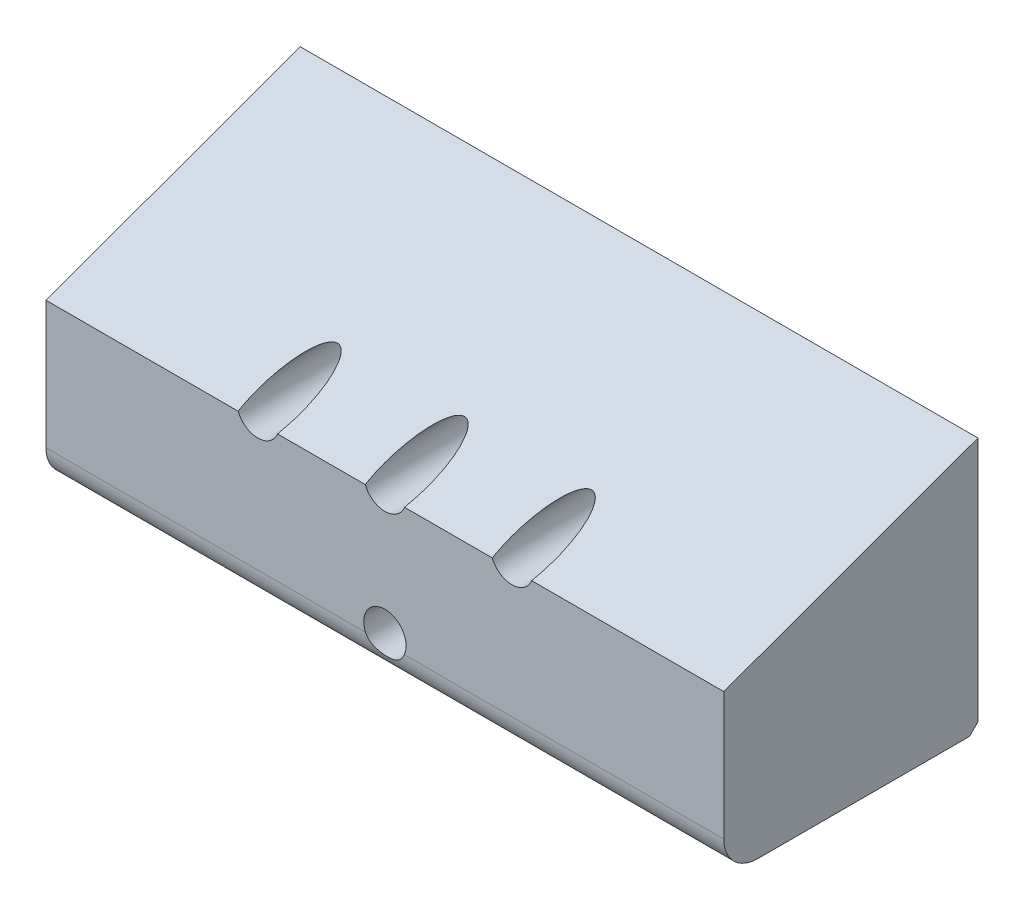
ISO-10303-21;
HEADER;
FILE_DESCRIPTION(('STEP AP214'),'2;1');
FILE_NAME('part.step','',(''),(''),'','','');
FILE_SCHEMA(('AUTOMOTIVE_DESIGN { 1 0 10303 214 1 1 1 1 }'));
ENDSEC;
DATA;
#1=APPLICATION_CONTEXT('core data for automotive mechanical design processes');
#2=APPLICATION_PROTOCOL_DEFINITION('international standard','automotive_design',2000,#1);
#3=PRODUCT_CONTEXT('',#1,'mechanical');
#4=PRODUCT('Part','Part','',(#3));
#5=PRODUCT_RELATED_PRODUCT_CATEGORY('part','',(#4));
#6=PRODUCT_DEFINITION_FORMATION('','',#4);
#7=PRODUCT_DEFINITION_CONTEXT('part definition',#1,'design');
#8=PRODUCT_DEFINITION('design','',#6,#7);
#9=PRODUCT_DEFINITION_SHAPE('','',#8);
#10=(LENGTH_UNIT() NAMED_UNIT(*) SI_UNIT(.MILLI.,.METRE.));
#11=(NAMED_UNIT(*) PLANE_ANGLE_UNIT() SI_UNIT($,.RADIAN.));
#12=(NAMED_UNIT(*) SI_UNIT($,.STERADIAN.) SOLID_ANGLE_UNIT());
#13=UNCERTAINTY_MEASURE_WITH_UNIT(LENGTH_MEASURE(1.E-05),#10,'distance_accuracy_value','');
#14=(GEOMETRIC_REPRESENTATION_CONTEXT(3) GLOBAL_UNCERTAINTY_ASSIGNED_CONTEXT((#13)) GLOBAL_UNIT_ASSIGNED_CONTEXT((#10,
#11,#12)) REPRESENTATION_CONTEXT('',''));
#15=CARTESIAN_POINT('',(0.,0.,0.));
#16=DIRECTION('',(0.,0.,1.));
#17=DIRECTION('',(1.,0.,0.));
#18=AXIS2_PLACEMENT_3D('',#15,#16,#17);
#19=CARTESIAN_POINT('',(-40.,-9.54044648600701,0.));
#20=DIRECTION('',(0.,0.,1.));
#21=DIRECTION('',(1.,0.,0.));
#22=AXIS2_PLACEMENT_3D('',#19,#20,#21);
#23=PLANE('',#22);
#24=CARTESIAN_POINT('',(-20.,-7.04044648600701,0.));
#25=DIRECTION('',(0.,0.,-1.));
#26=DIRECTION('',(-1.,0.,0.));
#27=AXIS2_PLACEMENT_3D('',#24,#25,#26);
#28=CIRCLE('',#27,1.25);
#29=CARTESIAN_POINT('',(-21.145643923739,-7.54044648600701,0.));
#30=VERTEX_POINT('',#29);
#31=CARTESIAN_POINT('',(-18.854356076261,-7.54044648600701,0.));
#32=VERTEX_POINT('',#31);
#33=EDGE_CURVE('E122',#30,#32,#28,.T.);
#34=ORIENTED_EDGE('',*,*,#33,.T.);
#35=DIRECTION('',(1.,0.,0.));
#36=VECTOR('',#35,1.);
#37=CARTESIAN_POINT('',(-40.,-7.54044648600701,0.));
#38=LINE('',#37,#36);
#39=CARTESIAN_POINT('',(0.,-7.54044648600701,0.));
#40=VERTEX_POINT('',#39);
#41=EDGE_CURVE('E129',#32,#40,#38,.T.);
#42=ORIENTED_EDGE('',*,*,#41,.T.);
#43=DIRECTION('',(0.,-1.,0.));
#44=VECTOR('',#43,1.);
#45=CARTESIAN_POINT('',(0.,-9.54044648600701,0.));
#46=LINE('',#45,#44);
#47=CARTESIAN_POINT('',(0.,0.,0.));
#48=VERTEX_POINT('',#47);
#49=EDGE_CURVE('E208',#48,#40,#46,.T.);
#50=ORIENTED_EDGE('',*,*,#49,.F.);
#51=DIRECTION('',(1.,0.,0.));
#52=VECTOR('',#51,1.);
#53=CARTESIAN_POINT('',(-40.,0.,0.));
#54=LINE('',#53,#52);
#55=CARTESIAN_POINT('',(-11.3375411543729,0.,0.));
#56=VERTEX_POINT('',#55);
#57=EDGE_CURVE('E149',#56,#48,#54,.T.);
#58=ORIENTED_EDGE('',*,*,#57,.F.);
#59=CARTESIAN_POINT('',(-12.5,0.459553513992991,0.));
#60=DIRECTION('',(0.,0.,-1.));
#61=DIRECTION('',(-1.,0.,0.));
#62=AXIS2_PLACEMENT_3D('',#59,#60,#61);
#63=CIRCLE('',#62,1.25);
#64=CARTESIAN_POINT('',(-13.6624588456271,0.,0.));
#65=VERTEX_POINT('',#64);
#66=EDGE_CURVE('E58',#56,#65,#63,.T.);
#67=ORIENTED_EDGE('',*,*,#66,.T.);
#68=CARTESIAN_POINT('',(-18.8375411543729,0.,0.));
#69=VERTEX_POINT('',#68);
#70=EDGE_CURVE('E260',#69,#65,#54,.T.);
#71=ORIENTED_EDGE('',*,*,#70,.F.);
#72=CARTESIAN_POINT('',(-20.,0.459553513992991,0.));
#73=DIRECTION('',(0.,0.,-1.));
#74=DIRECTION('',(-1.,0.,0.));
#75=AXIS2_PLACEMENT_3D('',#72,#73,#74);
#76=CIRCLE('',#75,1.25);
#77=CARTESIAN_POINT('',(-21.1624588456271,0.,0.));
#78=VERTEX_POINT('',#77);
#79=EDGE_CURVE('E65',#69,#78,#76,.T.);
#80=ORIENTED_EDGE('',*,*,#79,.T.);
#81=CARTESIAN_POINT('',(-26.3375411543729,0.,0.));
#82=VERTEX_POINT('',#81);
#83=EDGE_CURVE('E147',#82,#78,#54,.T.);
#84=ORIENTED_EDGE('',*,*,#83,.F.);
#85=CARTESIAN_POINT('',(-27.5,0.459553513992993,0.));
#86=DIRECTION('',(0.,0.,-1.));
#87=DIRECTION('',(-1.,0.,0.));
#88=AXIS2_PLACEMENT_3D('',#85,#86,#87);
#89=CIRCLE('',#88,1.25);
#90=CARTESIAN_POINT('',(-28.6624588456271,0.,0.));
#91=VERTEX_POINT('',#90);
#92=EDGE_CURVE('E234',#82,#91,#89,.T.);
#93=ORIENTED_EDGE('',*,*,#92,.T.);
#94=CARTESIAN_POINT('',(-40.,0.,0.));
#95=VERTEX_POINT('',#94);
#96=EDGE_CURVE('E142',#95,#91,#54,.T.);
#97=ORIENTED_EDGE('',*,*,#96,.F.);
#98=DIRECTION('',(0.,-1.,0.));
#99=VECTOR('',#98,1.);
#100=CARTESIAN_POINT('',(-40.,-9.54044648600701,0.));
#101=LINE('',#100,#99);
#102=CARTESIAN_POINT('',(-40.,-7.54044648600701,0.));
#103=VERTEX_POINT('',#102);
#104=EDGE_CURVE('E189',#95,#103,#101,.T.);
#105=ORIENTED_EDGE('',*,*,#104,.T.);
#106=EDGE_CURVE('E132',#103,#30,#38,.T.);
#107=ORIENTED_EDGE('',*,*,#106,.T.);
#108=EDGE_LOOP('',(#34,#42,#50,#58,#67,#71,#80,#84,#93,#97,#105,#107));
#109=FACE_BOUND('',#108,.T.);
#110=ADVANCED_FACE('F38',(#109),#23,.T.);
#111=CARTESIAN_POINT('',(-40.,0.,0.));
#112=DIRECTION('',(0.,0.939692620785909,0.342020143325666));
#113=DIRECTION('',(0.,-0.342020143325666,0.939692620785909));
#114=AXIS2_PLACEMENT_3D('',#111,#112,#113);
#115=PLANE('',#114);
#116=CARTESIAN_POINT('',(-12.5,0.459553513992991,-1.26261290272678));
#117=DIRECTION('',(0.,0.939692620785909,0.342020143325666));
#118=DIRECTION('',(0.,0.342020143325666,-0.939692620785909));
#119=AXIS2_PLACEMENT_3D('',#116,#117,#118);
#120=ELLIPSE('',#119,3.65475550020389,1.25);
#121=EDGE_CURVE('E213',#56,#65,#120,.T.);
#122=ORIENTED_EDGE('',*,*,#121,.F.);
#123=ORIENTED_EDGE('',*,*,#57,.T.);
#124=DIRECTION('',(0.,-0.342020143325666,0.939692620785909));
#125=VECTOR('',#124,1.);
#126=CARTESIAN_POINT('',(0.,0.,0.));
#127=LINE('',#126,#125);
#128=CARTESIAN_POINT('',(0.,5.45955351399299,-15.));
#129=VERTEX_POINT('',#128);
#130=EDGE_CURVE('E203',#129,#48,#127,.T.);
#131=ORIENTED_EDGE('',*,*,#130,.F.);
#132=DIRECTION('',(1.,0.,0.));
#133=VECTOR('',#132,1.);
#134=CARTESIAN_POINT('',(-40.,5.45955351399299,-15.));
#135=LINE('',#134,#133);
#136=CARTESIAN_POINT('',(-40.,5.45955351399299,-15.));
#137=VERTEX_POINT('',#136);
#138=EDGE_CURVE('E152',#137,#129,#135,.T.);
#139=ORIENTED_EDGE('',*,*,#138,.F.);
#140=DIRECTION('',(0.,-0.342020143325666,0.939692620785909));
#141=VECTOR('',#140,1.);
#142=CARTESIAN_POINT('',(-40.,0.,0.));
#143=LINE('',#142,#141);
#144=EDGE_CURVE('E214',#137,#95,#143,.T.);
#145=ORIENTED_EDGE('',*,*,#144,.T.);
#146=ORIENTED_EDGE('',*,*,#96,.T.);
#147=CARTESIAN_POINT('',(-27.5,0.459553513992993,-1.26261290272678));
#148=DIRECTION('',(0.,0.939692620785909,0.342020143325666));
#149=DIRECTION('',(0.,0.342020143325666,-0.939692620785909));
#150=AXIS2_PLACEMENT_3D('',#147,#148,#149);
#151=ELLIPSE('',#150,3.65475550020389,1.25);
#152=EDGE_CURVE('E224',#82,#91,#151,.T.);
#153=ORIENTED_EDGE('',*,*,#152,.F.);
#154=ORIENTED_EDGE('',*,*,#83,.T.);
#155=CARTESIAN_POINT('',(-20.,0.459553513992991,-1.26261290272678));
#156=DIRECTION('',(0.,0.939692620785909,0.342020143325666));
#157=DIRECTION('',(0.,0.342020143325666,-0.939692620785909));
#158=AXIS2_PLACEMENT_3D('',#155,#156,#157);
#159=ELLIPSE('',#158,3.65475550020389,1.25);
#160=EDGE_CURVE('E227',#69,#78,#159,.T.);
#161=ORIENTED_EDGE('',*,*,#160,.F.);
#162=ORIENTED_EDGE('',*,*,#70,.T.);
#163=EDGE_LOOP('',(#122,#123,#131,#139,#145,#146,#153,#154,#161,#162));
#164=FACE_BOUND('',#163,.T.);
#165=ADVANCED_FACE('F257',(#164),#115,.T.);
#166=CARTESIAN_POINT('',(-40.,5.45955351399299,-15.));
#167=DIRECTION('',(0.,0.,-1.));
#168=DIRECTION('',(-1.,0.,0.));
#169=AXIS2_PLACEMENT_3D('',#166,#167,#168);
#170=PLANE('',#169);
#171=CARTESIAN_POINT('',(-20.,-7.04044648600701,-15.));
#172=DIRECTION('',(0.,0.,-1.));
#173=DIRECTION('',(-1.,0.,0.));
#174=AXIS2_PLACEMENT_3D('',#171,#172,#173);
#175=CIRCLE('',#174,1.25);
#176=CARTESIAN_POINT('',(-21.25,-7.04044648600701,-15.));
#177=VERTEX_POINT('',#176);
#178=EDGE_CURVE('E135',#177,#177,#175,.T.);
#179=ORIENTED_EDGE('',*,*,#178,.F.);
#180=EDGE_LOOP('',(#179));
#181=FACE_BOUND('',#180,.T.);
#182=CARTESIAN_POINT('',(-12.5,0.459553513992991,-15.));
#183=DIRECTION('',(0.,0.,-1.));
#184=DIRECTION('',(-1.,0.,0.));
#185=AXIS2_PLACEMENT_3D('',#182,#183,#184);
#186=CIRCLE('',#185,1.25);
#187=CARTESIAN_POINT('',(-13.75,0.459553513992991,-15.));
#188=VERTEX_POINT('',#187);
#189=EDGE_CURVE('E134',#188,#188,#186,.T.);
#190=ORIENTED_EDGE('',*,*,#189,.F.);
#191=EDGE_LOOP('',(#190));
#192=FACE_BOUND('',#191,.T.);
#193=CARTESIAN_POINT('',(-27.5,0.459553513992993,-15.));
#194=DIRECTION('',(0.,0.,-1.));
#195=DIRECTION('',(-1.,0.,0.));
#196=AXIS2_PLACEMENT_3D('',#193,#194,#195);
#197=CIRCLE('',#196,1.25);
#198=CARTESIAN_POINT('',(-28.75,0.459553513992993,-15.));
#199=VERTEX_POINT('',#198);
#200=EDGE_CURVE('E245',#199,#199,#197,.T.);
#201=ORIENTED_EDGE('',*,*,#200,.F.);
#202=EDGE_LOOP('',(#201));
#203=FACE_BOUND('',#202,.T.);
#204=CARTESIAN_POINT('',(-20.,0.459553513992991,-15.));
#205=DIRECTION('',(0.,0.,-1.));
#206=DIRECTION('',(-1.,0.,0.));
#207=AXIS2_PLACEMENT_3D('',#204,#205,#206);
#208=CIRCLE('',#207,1.25);
#209=CARTESIAN_POINT('',(-21.25,0.459553513992991,-15.));
#210=VERTEX_POINT('',#209);
#211=EDGE_CURVE('E230',#210,#210,#208,.T.);
#212=ORIENTED_EDGE('',*,*,#211,.F.);
#213=EDGE_LOOP('',(#212));
#214=FACE_BOUND('',#213,.T.);
#215=DIRECTION('',(0.,1.,0.));
#216=VECTOR('',#215,1.);
#217=CARTESIAN_POINT('',(0.,5.45955351399299,-15.));
#218=LINE('',#217,#216);
#219=CARTESIAN_POINT('',(0.,-9.04044648600701,-15.));
#220=VERTEX_POINT('',#219);
#221=EDGE_CURVE('E195',#220,#129,#218,.T.);
#222=ORIENTED_EDGE('',*,*,#221,.F.);
#223=DIRECTION('',(-1.,0.,0.));
#224=VECTOR('',#223,1.);
#225=CARTESIAN_POINT('',(-40.,-9.04044648600702,-15.));
#226=LINE('',#225,#224);
#227=CARTESIAN_POINT('',(-40.,-9.04044648600701,-15.));
#228=VERTEX_POINT('',#227);
#229=EDGE_CURVE('E168',#220,#228,#226,.T.);
#230=ORIENTED_EDGE('',*,*,#229,.T.);
#231=DIRECTION('',(0.,1.,0.));
#232=VECTOR('',#231,1.);
#233=CARTESIAN_POINT('',(-40.,5.45955351399299,-15.));
#234=LINE('',#233,#232);
#235=EDGE_CURVE('E180',#228,#137,#234,.T.);
#236=ORIENTED_EDGE('',*,*,#235,.T.);
#237=ORIENTED_EDGE('',*,*,#138,.T.);
#238=EDGE_LOOP('',(#222,#230,#236,#237));
#239=FACE_BOUND('',#238,.T.);
#240=ADVANCED_FACE('F199',(#181,#192,#203,#214,#239),#170,.T.);
#241=CARTESIAN_POINT('',(-40.,-9.54044648600701,-15.));
#242=DIRECTION('',(0.,-1.,0.));
#243=DIRECTION('',(0.,0.,-1.));
#244=AXIS2_PLACEMENT_3D('',#241,#242,#243);
#245=PLANE('',#244);
#246=DIRECTION('',(0.,0.,-1.));
#247=VECTOR('',#246,1.);
#248=CARTESIAN_POINT('',(-40.,-9.54044648600701,-15.));
#249=LINE('',#248,#247);
#250=CARTESIAN_POINT('',(-40.,-9.54044648600701,-2.));
#251=VERTEX_POINT('',#250);
#252=CARTESIAN_POINT('',(-40.,-9.54044648600701,-14.5));
#253=VERTEX_POINT('',#252);
#254=EDGE_CURVE('E177',#251,#253,#249,.T.);
#255=ORIENTED_EDGE('',*,*,#254,.T.);
#256=DIRECTION('',(1.,0.,0.));
#257=VECTOR('',#256,1.);
#258=CARTESIAN_POINT('',(-40.,-9.54044648600701,-14.5));
#259=LINE('',#258,#257);
#260=CARTESIAN_POINT('',(0.,-9.54044648600701,-14.5));
#261=VERTEX_POINT('',#260);
#262=EDGE_CURVE('E161',#253,#261,#259,.T.);
#263=ORIENTED_EDGE('',*,*,#262,.T.);
#264=DIRECTION('',(0.,0.,-1.));
#265=VECTOR('',#264,1.);
#266=CARTESIAN_POINT('',(0.,-9.54044648600701,-15.));
#267=LINE('',#266,#265);
#268=CARTESIAN_POINT('',(0.,-9.54044648600701,-2.));
#269=VERTEX_POINT('',#268);
#270=EDGE_CURVE('E197',#269,#261,#267,.T.);
#271=ORIENTED_EDGE('',*,*,#270,.F.);
#272=DIRECTION('',(1.,0.,0.));
#273=VECTOR('',#272,1.);
#274=CARTESIAN_POINT('',(-40.,-9.54044648600701,-2.));
#275=LINE('',#274,#273);
#276=EDGE_CURVE('E155',#269,#251,#275,.F.);
#277=ORIENTED_EDGE('',*,*,#276,.T.);
#278=EDGE_LOOP('',(#255,#263,#271,#277));
#279=FACE_BOUND('',#278,.T.);
#280=ADVANCED_FACE('F185',(#279),#245,.T.);
#281=CARTESIAN_POINT('',(-40.,0.,0.));
#282=DIRECTION('',(1.,0.,0.));
#283=DIRECTION('',(0.,0.,-1.));
#284=AXIS2_PLACEMENT_3D('',#281,#282,#283);
#285=PLANE('',#284);
#286=ORIENTED_EDGE('',*,*,#235,.F.);
#287=DIRECTION('',(0.,0.707106781186548,-0.707106781186548));
#288=VECTOR('',#287,1.);
#289=CARTESIAN_POINT('',(-40.,-9.54044648600701,-14.5));
#290=LINE('',#289,#288);
#291=EDGE_CURVE('E52',#228,#253,#290,.F.);
#292=ORIENTED_EDGE('',*,*,#291,.T.);
#293=ORIENTED_EDGE('',*,*,#254,.F.);
#294=CARTESIAN_POINT('',(-40.,-7.54044648600701,-2.));
#295=DIRECTION('',(1.,0.,0.));
#296=DIRECTION('',(0.,0.,-1.));
#297=AXIS2_PLACEMENT_3D('',#294,#295,#296);
#298=CIRCLE('',#297,2.);
#299=EDGE_CURVE('E158',#251,#103,#298,.F.);
#300=ORIENTED_EDGE('',*,*,#299,.T.);
#301=ORIENTED_EDGE('',*,*,#104,.F.);
#302=ORIENTED_EDGE('',*,*,#144,.F.);
#303=EDGE_LOOP('',(#286,#292,#293,#300,#301,#302));
#304=FACE_BOUND('',#303,.T.);
#305=ADVANCED_FACE('F176',(#304),#285,.F.);
#306=CARTESIAN_POINT('',(0.,0.,0.));
#307=DIRECTION('',(1.,0.,0.));
#308=DIRECTION('',(0.,0.,-1.));
#309=AXIS2_PLACEMENT_3D('',#306,#307,#308);
#310=PLANE('',#309);
#311=ORIENTED_EDGE('',*,*,#270,.T.);
#312=DIRECTION('',(0.,-0.707106781186548,0.707106781186548));
#313=VECTOR('',#312,1.);
#314=CARTESIAN_POINT('',(0.,-12.0202232430035,-12.0202232430035));
#315=LINE('',#314,#313);
#316=EDGE_CURVE('E165',#261,#220,#315,.F.);
#317=ORIENTED_EDGE('',*,*,#316,.T.);
#318=ORIENTED_EDGE('',*,*,#221,.T.);
#319=ORIENTED_EDGE('',*,*,#130,.T.);
#320=ORIENTED_EDGE('',*,*,#49,.T.);
#321=CARTESIAN_POINT('',(0.,-7.54044648600701,-2.));
#322=DIRECTION('',(1.,0.,0.));
#323=DIRECTION('',(0.,0.,-1.));
#324=AXIS2_PLACEMENT_3D('',#321,#322,#323);
#325=CIRCLE('',#324,2.);
#326=EDGE_CURVE('E139',#40,#269,#325,.T.);
#327=ORIENTED_EDGE('',*,*,#326,.T.);
#328=EDGE_LOOP('',(#311,#317,#318,#319,#320,#327));
#329=FACE_BOUND('',#328,.T.);
#330=ADVANCED_FACE('F193',(#329),#310,.T.);
#331=CARTESIAN_POINT('',(-40.,-7.54044648600701,-2.));
#332=DIRECTION('',(1.,0.,0.));
#333=DIRECTION('',(0.,0.,-1.));
#334=AXIS2_PLACEMENT_3D('',#331,#332,#333);
#335=CYLINDRICAL_SURFACE('',#334,2.);
#336=CARTESIAN_POINT('',(-21.145643923739,-7.54044648600701,0.));
#337=CARTESIAN_POINT('',(-21.1320253847675,-7.57165520168059,2.81099343661778E-06));
#338=CARTESIAN_POINT('',(-21.1171371269755,-7.60228370351672,-0.000730853146854539));
#339=CARTESIAN_POINT('',(-21.0849531114166,-7.66216263989177,-0.00348284579442054));
#340=CARTESIAN_POINT('',(-21.067659010654,-7.69141400451984,-0.00550029349593507));
#341=CARTESIAN_POINT('',(-21.012506390568,-7.77657466456455,-0.0131741037871918));
#342=CARTESIAN_POINT('',(-20.9712486129007,-7.83018418738218,-0.0204554420892227));
#343=CARTESIAN_POINT('',(-20.881042702486,-7.92970159581916,-0.0375946938238052));
#344=CARTESIAN_POINT('',(-20.8321109293646,-7.97562544501567,-0.0474471550767322));
#345=CARTESIAN_POINT('',(-20.7275898109127,-8.05906731281623,-0.067933690420088));
#346=CARTESIAN_POINT('',(-20.6719926407104,-8.0965753003486,-0.0785686773920324));
#347=CARTESIAN_POINT('',(-20.5520400198618,-8.16417051106373,-0.0993963066380441));
#348=CARTESIAN_POINT('',(-20.4873662383325,-8.19371412054954,-0.109529356610992));
#349=CARTESIAN_POINT('',(-20.3535983616684,-8.24148948308311,-0.126716838224711));
#350=CARTESIAN_POINT('',(-20.2845072066701,-8.25972867547018,-0.133773293637044));
#351=CARTESIAN_POINT('',(-20.1460495432469,-8.283810378327,-0.143235116168308));
#352=CARTESIAN_POINT('',(-20.07675554736,-8.29001362379377,-0.145775628797895));
#353=CARTESIAN_POINT('',(-19.9380975885523,-8.2908352249131,-0.146107279286777));
#354=CARTESIAN_POINT('',(-19.8687336465743,-8.28545637842759,-0.143899564165748));
#355=CARTESIAN_POINT('',(-19.7359711091784,-8.26399003015456,-0.135434889934317));
#356=CARTESIAN_POINT('',(-19.6724558770511,-8.24851843606669,-0.129411366856939));
#357=CARTESIAN_POINT('',(-19.5488822539763,-8.20801880592045,-0.114579735419526));
#358=CARTESIAN_POINT('',(-19.488825579087,-8.18298607206139,-0.105770258566735));
#359=CARTESIAN_POINT('',(-19.3707166419216,-8.12262386678882,-0.0863339821712984));
#360=CARTESIAN_POINT('',(-19.3128980415315,-8.08685876375952,-0.0756403635111378));
#361=CARTESIAN_POINT('',(-19.2038010570304,-8.0064502763012,-0.054603350388966));
#362=CARTESIAN_POINT('',(-19.1525196166814,-7.961811065844,-0.0442597939403517));
#363=CARTESIAN_POINT('',(-19.052933758954,-7.85966927173184,-0.0248940527086097));
#364=CARTESIAN_POINT('',(-19.0054255740826,-7.80133106129054,-0.016103778078133));
#365=CARTESIAN_POINT('',(-18.9423715419917,-7.70779346417031,-0.00676442886430228));
#366=CARTESIAN_POINT('',(-18.922679030429,-7.6755125189393,-0.00429087452508826));
#367=CARTESIAN_POINT('',(-18.8862507079685,-7.60921229763747,-0.000905928005093315));
#368=CARTESIAN_POINT('',(-18.869517393651,-7.5751915846776,4.15070837313703E-06));
#369=CARTESIAN_POINT('',(-18.854356076261,-7.54044648600702,0.));
#370=B_SPLINE_CURVE_WITH_KNOTS('',3,(#336,#337,#338,#339,#340,#341,#342,#343,#344,#345,#346,
#347,#348,#349,#350,#351,#352,#353,#354,#355,#356,#357,#358,#359,#360,#361,#362,#363,#364,#365,
#366,#367,#368,#369),.UNSPECIFIED.,.F.,.F.,(4,2,2,2,2,2,2,2,2,2,2,2,2,2,2,2,4),(0.,
0.102072671332794,0.204075385855793,0.407132077015369,0.609761627832195,0.812631429718764,
1.02704341204841,1.24131414146198,1.44905714779642,1.65674997571401,1.85282385010251,
2.04899418824161,2.25455744089436,2.46002423384552,2.68581498724379,2.79933350350809,
2.91294733950622),.UNSPECIFIED.);
#371=EDGE_CURVE('E11',#30,#32,#370,.T.);
#372=ORIENTED_EDGE('',*,*,#371,.F.);
#373=ORIENTED_EDGE('',*,*,#106,.F.);
#374=ORIENTED_EDGE('',*,*,#299,.F.);
#375=ORIENTED_EDGE('',*,*,#276,.F.);
#376=ORIENTED_EDGE('',*,*,#326,.F.);
#377=ORIENTED_EDGE('',*,*,#41,.F.);
#378=EDGE_LOOP('',(#372,#373,#374,#375,#376,#377));
#379=FACE_BOUND('',#378,.T.);
#380=ADVANCED_FACE('F137',(#379),#335,.T.);
#381=CARTESIAN_POINT('',(-40.,-9.54044648600701,-14.5));
#382=DIRECTION('',(0.,0.707106781186547,0.707106781186547));
#383=DIRECTION('',(1.,0.,0.));
#384=AXIS2_PLACEMENT_3D('',#381,#382,#383);
#385=PLANE('',#384);
#386=ORIENTED_EDGE('',*,*,#291,.F.);
#387=ORIENTED_EDGE('',*,*,#229,.F.);
#388=ORIENTED_EDGE('',*,*,#316,.F.);
#389=ORIENTED_EDGE('',*,*,#262,.F.);
#390=EDGE_LOOP('',(#386,#387,#388,#389));
#391=FACE_BOUND('',#390,.T.);
#392=ADVANCED_FACE('F40',(#391),#385,.F.);
#393=CARTESIAN_POINT('',(-20.,-7.04044648600701,0.));
#394=DIRECTION('',(0.,0.,-1.));
#395=DIRECTION('',(-1.,0.,0.));
#396=AXIS2_PLACEMENT_3D('',#393,#394,#395);
#397=CYLINDRICAL_SURFACE('',#396,1.25);
#398=ORIENTED_EDGE('',*,*,#371,.T.);
#399=ORIENTED_EDGE('',*,*,#33,.F.);
#400=EDGE_LOOP('',(#398,#399));
#401=FACE_BOUND('',#400,.T.);
#402=ORIENTED_EDGE('',*,*,#178,.T.);
#403=EDGE_LOOP('',(#402));
#404=FACE_BOUND('',#403,.T.);
#405=ADVANCED_FACE('F120',(#401,#404),#397,.F.);
#406=CARTESIAN_POINT('',(-20.,0.459553513992991,0.));
#407=DIRECTION('',(0.,0.,-1.));
#408=DIRECTION('',(-1.,0.,0.));
#409=AXIS2_PLACEMENT_3D('',#406,#407,#408);
#410=CYLINDRICAL_SURFACE('',#409,1.25);
#411=ORIENTED_EDGE('',*,*,#160,.T.);
#412=ORIENTED_EDGE('',*,*,#79,.F.);
#413=EDGE_LOOP('',(#411,#412));
#414=FACE_BOUND('',#413,.T.);
#415=ORIENTED_EDGE('',*,*,#211,.T.);
#416=EDGE_LOOP('',(#415));
#417=FACE_BOUND('',#416,.T.);
#418=ADVANCED_FACE('F266',(#414,#417),#410,.F.);
#419=CARTESIAN_POINT('',(-27.5,0.459553513992993,0.));
#420=DIRECTION('',(0.,0.,-1.));
#421=DIRECTION('',(-1.,0.,0.));
#422=AXIS2_PLACEMENT_3D('',#419,#420,#421);
#423=CYLINDRICAL_SURFACE('',#422,1.25);
#424=ORIENTED_EDGE('',*,*,#152,.T.);
#425=ORIENTED_EDGE('',*,*,#92,.F.);
#426=EDGE_LOOP('',(#424,#425));
#427=FACE_BOUND('',#426,.T.);
#428=ORIENTED_EDGE('',*,*,#200,.T.);
#429=EDGE_LOOP('',(#428));
#430=FACE_BOUND('',#429,.T.);
#431=ADVANCED_FACE('F269',(#427,#430),#423,.F.);
#432=CARTESIAN_POINT('',(-12.5,0.459553513992991,0.));
#433=DIRECTION('',(0.,0.,-1.));
#434=DIRECTION('',(-1.,0.,0.));
#435=AXIS2_PLACEMENT_3D('',#432,#433,#434);
#436=CYLINDRICAL_SURFACE('',#435,1.25);
#437=ORIENTED_EDGE('',*,*,#121,.T.);
#438=ORIENTED_EDGE('',*,*,#66,.F.);
#439=EDGE_LOOP('',(#437,#438));
#440=FACE_BOUND('',#439,.T.);
#441=ORIENTED_EDGE('',*,*,#189,.T.);
#442=EDGE_LOOP('',(#441));
#443=FACE_BOUND('',#442,.T.);
#444=ADVANCED_FACE('F304',(#440,#443),#436,.F.);
#445=CLOSED_SHELL('',(#110,#165,#240,#280,#305,#330,#380,#392,#405,#418,#431,#444));
#446=MANIFOLD_SOLID_BREP('B2',#445);
#447=ADVANCED_BREP_SHAPE_REPRESENTATION('',(#18,#446),#14);
#448=SHAPE_DEFINITION_REPRESENTATION(#9,#447);
ENDSEC;
END-ISO-10303-21;
